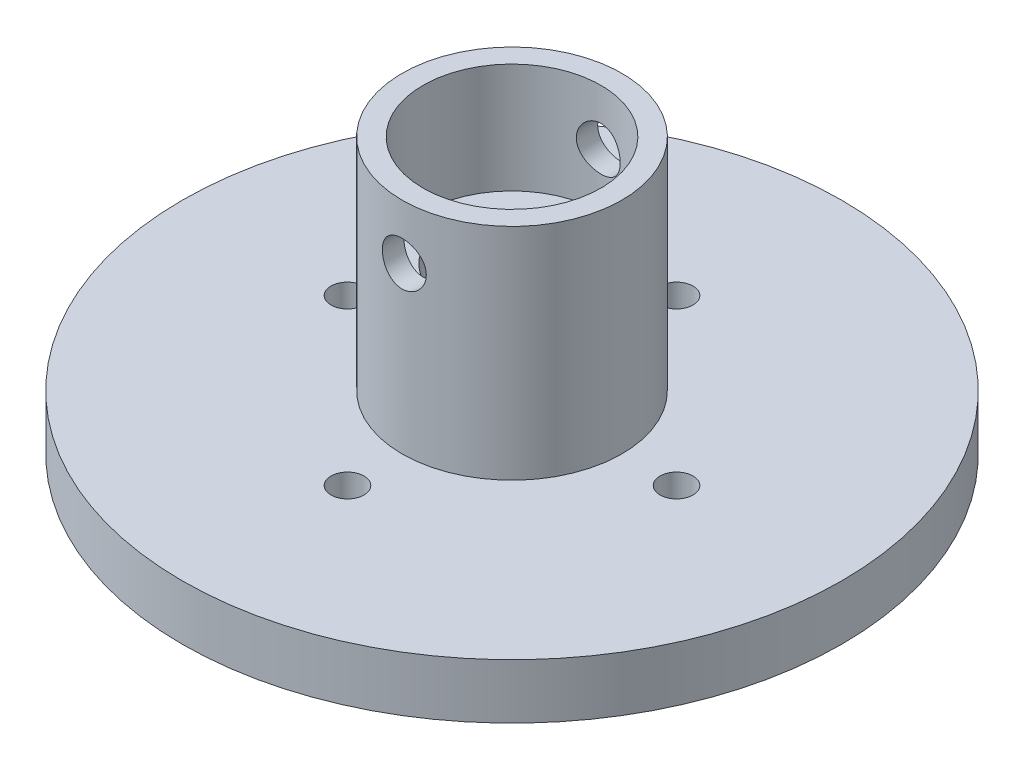
ISO-10303-21;
HEADER;
FILE_DESCRIPTION(('STEP AP214'),'2;1');
FILE_NAME('part.step','',(''),(''),'','','');
FILE_SCHEMA(('AUTOMOTIVE_DESIGN { 1 0 10303 214 1 1 1 1 }'));
ENDSEC;
DATA;
#1=APPLICATION_CONTEXT('core data for automotive mechanical design processes');
#2=APPLICATION_PROTOCOL_DEFINITION('international standard','automotive_design',2000,#1);
#3=PRODUCT_CONTEXT('',#1,'mechanical');
#4=PRODUCT('Part','Part','',(#3));
#5=PRODUCT_RELATED_PRODUCT_CATEGORY('part','',(#4));
#6=PRODUCT_DEFINITION_FORMATION('','',#4);
#7=PRODUCT_DEFINITION_CONTEXT('part definition',#1,'design');
#8=PRODUCT_DEFINITION('design','',#6,#7);
#9=PRODUCT_DEFINITION_SHAPE('','',#8);
#10=(LENGTH_UNIT() NAMED_UNIT(*) SI_UNIT(.MILLI.,.METRE.));
#11=(NAMED_UNIT(*) PLANE_ANGLE_UNIT() SI_UNIT($,.RADIAN.));
#12=(NAMED_UNIT(*) SI_UNIT($,.STERADIAN.) SOLID_ANGLE_UNIT());
#13=UNCERTAINTY_MEASURE_WITH_UNIT(LENGTH_MEASURE(1.E-05),#10,'distance_accuracy_value','');
#14=(GEOMETRIC_REPRESENTATION_CONTEXT(3) GLOBAL_UNCERTAINTY_ASSIGNED_CONTEXT((#13)) GLOBAL_UNIT_ASSIGNED_CONTEXT((#10,
#11,#12)) REPRESENTATION_CONTEXT('',''));
#15=CARTESIAN_POINT('',(0.,0.,0.));
#16=DIRECTION('',(0.,0.,1.));
#17=DIRECTION('',(1.,0.,0.));
#18=AXIS2_PLACEMENT_3D('',#15,#16,#17);
#19=CARTESIAN_POINT('',(0.,-105.,0.));
#20=DIRECTION('',(0.,1.,0.));
#21=DIRECTION('',(0.,0.,1.));
#22=AXIS2_PLACEMENT_3D('',#19,#20,#21);
#23=CYLINDRICAL_SURFACE('',#22,6.);
#24=CARTESIAN_POINT('',(0.,0.,0.));
#25=DIRECTION('',(0.,1.,0.));
#26=DIRECTION('',(0.,0.,1.));
#27=AXIS2_PLACEMENT_3D('',#24,#25,#26);
#28=CIRCLE('',#27,6.);
#29=CARTESIAN_POINT('',(0.,0.,6.));
#30=VERTEX_POINT('',#29);
#31=EDGE_CURVE('E59',#30,#30,#28,.T.);
#32=ORIENTED_EDGE('',*,*,#31,.F.);
#33=EDGE_LOOP('',(#32));
#34=FACE_BOUND('',#33,.T.);
#35=CARTESIAN_POINT('',(0.,15.,0.));
#36=DIRECTION('',(0.,1.,0.));
#37=DIRECTION('',(0.,0.,1.));
#38=AXIS2_PLACEMENT_3D('',#35,#36,#37);
#39=CIRCLE('',#38,6.);
#40=CARTESIAN_POINT('',(0.,15.,6.));
#41=VERTEX_POINT('',#40);
#42=EDGE_CURVE('E82',#41,#41,#39,.F.);
#43=ORIENTED_EDGE('',*,*,#42,.F.);
#44=EDGE_LOOP('',(#43));
#45=FACE_BOUND('',#44,.T.);
#46=ADVANCED_FACE('F36',(#34,#45),#23,.F.);
#47=CARTESIAN_POINT('',(0.,95.,0.));
#48=DIRECTION('',(0.,-1.,0.));
#49=DIRECTION('',(0.,0.,-1.));
#50=AXIS2_PLACEMENT_3D('',#47,#48,#49);
#51=CYLINDRICAL_SURFACE('',#50,10.);
#52=CARTESIAN_POINT('',(0.,18.,10.));
#53=CARTESIAN_POINT('',(-0.111153813585266,18.0000040889967,9.99999795161742));
#54=CARTESIAN_POINT('',(-0.222359320403045,18.0092976859353,9.99812770356462));
#55=CARTESIAN_POINT('',(-0.441627015378039,18.0461970002305,9.99084731246463));
#56=CARTESIAN_POINT('',(-0.549686635082712,18.073817265603,9.98543435720372));
#57=CARTESIAN_POINT('',(-0.759460610526626,18.1464825472416,9.97167298556573));
#58=CARTESIAN_POINT('',(-0.861180935866267,18.1915108736894,9.96332738153436));
#59=CARTESIAN_POINT('',(-1.05561597772845,18.2976644950226,9.94460796070629));
#60=CARTESIAN_POINT('',(-1.14833123015162,18.3587888312144,9.93423426471414));
#61=CARTESIAN_POINT('',(-1.32338695462973,18.4962769885829,9.9124433065994));
#62=CARTESIAN_POINT('',(-1.40558790231705,18.5728167107824,9.90101491008695));
#63=CARTESIAN_POINT('',(-1.55607351321606,18.7385848327834,9.87848360905177));
#64=CARTESIAN_POINT('',(-1.62435708954085,18.8278142226702,9.86738073000848));
#65=CARTESIAN_POINT('',(-1.74566350669524,19.0174323860237,9.8466488362523));
#66=CARTESIAN_POINT('',(-1.79854187773174,19.1179152875927,9.83703414729892));
#67=CARTESIAN_POINT('',(-1.88661133316062,19.3265636380081,9.82052536116836));
#68=CARTESIAN_POINT('',(-1.92180416487448,19.4347283266927,9.81363099523923));
#69=CARTESIAN_POINT('',(-1.97305059976966,19.6541687278158,9.80345610504409));
#70=CARTESIAN_POINT('',(-1.98934899591756,19.7653850882844,9.80012940214375));
#71=CARTESIAN_POINT('',(-2.00310425545224,19.9890196427287,9.79732750121254));
#72=CARTESIAN_POINT('',(-2.000563045427,20.1014377126403,9.79785190935681));
#73=CARTESIAN_POINT('',(-1.97690914620364,20.322493576042,9.80265102296369));
#74=CARTESIAN_POINT('',(-1.95607708048781,20.4311628112546,9.80686905717527));
#75=CARTESIAN_POINT('',(-1.8968757692461,20.643432153326,9.81849092320002));
#76=CARTESIAN_POINT('',(-1.85850568620136,20.747032017838,9.82589490715558));
#77=CARTESIAN_POINT('',(-1.76504956734944,20.9470305234072,9.84311237000816));
#78=CARTESIAN_POINT('',(-1.70985230246423,21.0433757591383,9.85294179627409));
#79=CARTESIAN_POINT('',(-1.58438714914536,21.2255416999456,9.87389237546124));
#80=CARTESIAN_POINT('',(-1.51411752871366,21.3113611937023,9.88501367676732));
#81=CARTESIAN_POINT('',(-1.35899986912117,21.4716588049139,9.90754042482924));
#82=CARTESIAN_POINT('',(-1.27391232242489,21.5459051357183,9.9189473842181));
#83=CARTESIAN_POINT('',(-1.09237004812402,21.6791076926024,9.94057697428817));
#84=CARTESIAN_POINT('',(-0.99591517475878,21.7380637225871,9.95079958977947));
#85=CARTESIAN_POINT('',(-0.794118773757843,21.8390550184519,9.96893380321774));
#86=CARTESIAN_POINT('',(-0.688763639170602,21.8810637872891,9.97684177696544));
#87=CARTESIAN_POINT('',(-0.472297952897332,21.9467209480771,9.98942817975717));
#88=CARTESIAN_POINT('',(-0.361188100144901,21.9703715641472,9.99410700001063));
#89=CARTESIAN_POINT('',(-0.138358811254303,21.9983129075885,9.99965343733735));
#90=CARTESIAN_POINT('',(-0.0266806566511544,22.0029208390805,10.0005834930494));
#91=CARTESIAN_POINT('',(0.195849868385427,21.9935002821156,9.99870103860205));
#92=CARTESIAN_POINT('',(0.306702284887585,21.9794728412948,9.99588873882892));
#93=CARTESIAN_POINT('',(0.52341131989308,21.9334432529121,9.98687664016035));
#94=CARTESIAN_POINT('',(0.629303896679804,21.9016038630042,9.98070752808413));
#95=CARTESIAN_POINT('',(0.834247254999332,21.8210320346884,9.96567104122065));
#96=CARTESIAN_POINT('',(0.933297523275078,21.7722983306463,9.95680346428454));
#97=CARTESIAN_POINT('',(1.12308234737243,21.6586350186974,9.93719823066589));
#98=CARTESIAN_POINT('',(1.21370025350438,21.5935144379221,9.92643900874104));
#99=CARTESIAN_POINT('',(1.38283603823841,21.4491816175854,9.90429469659765));
#100=CARTESIAN_POINT('',(1.46135261786152,21.3699678672003,9.89290953936776));
#101=CARTESIAN_POINT('',(1.60528118154835,21.1982532962177,9.8705860711393));
#102=CARTESIAN_POINT('',(1.67047540489731,21.1055685115573,9.85965720466609));
#103=CARTESIAN_POINT('',(1.78437084010241,20.9103772772866,9.83968383592389));
#104=CARTESIAN_POINT('',(1.8330727118458,20.8078712208529,9.83063925826685));
#105=CARTESIAN_POINT('',(1.91230368316392,20.5964635077009,9.81553481168766));
#106=CARTESIAN_POINT('',(1.9429269995821,20.4875983175794,9.80945949744373));
#107=CARTESIAN_POINT('',(1.98541730325439,20.2661330930182,9.8009487358405));
#108=CARTESIAN_POINT('',(1.99728673645022,20.1535335475813,9.79851281382223));
#109=CARTESIAN_POINT('',(2.00184182173494,19.9299822709114,9.79758299262758));
#110=CARTESIAN_POINT('',(1.99487157614179,19.819037702146,9.79901838378602));
#111=CARTESIAN_POINT('',(1.96270460820012,19.5999367001899,9.80551146969228));
#112=CARTESIAN_POINT('',(1.9375080322586,19.4917802446104,9.81056913534338));
#113=CARTESIAN_POINT('',(1.86975713699791,19.2815445775189,9.82370528438317));
#114=CARTESIAN_POINT('',(1.82724501343469,19.1794512789952,9.83177642037661));
#115=CARTESIAN_POINT('',(1.72610928920321,18.9837925585311,9.85003429948341));
#116=CARTESIAN_POINT('',(1.66748433754976,18.8902278525497,9.86022121997788));
#117=CARTESIAN_POINT('',(1.53461182957283,18.7125688556994,9.88177921046451));
#118=CARTESIAN_POINT('',(1.46011577447036,18.6286624694648,9.89316745819399));
#119=CARTESIAN_POINT('',(1.29812873802628,18.4744275889417,9.91572163743909));
#120=CARTESIAN_POINT('',(1.21063477430667,18.4041022193654,9.92688751726369));
#121=CARTESIAN_POINT('',(1.02403525817649,18.2783307121071,9.94787664775943));
#122=CARTESIAN_POINT('',(0.92481776885967,18.2230479934399,9.95768462438492));
#123=CARTESIAN_POINT('',(0.718332721881466,18.1300277548068,9.9747025017));
#124=CARTESIAN_POINT('',(0.611072521726254,18.092274420935,9.98191474277232));
#125=CARTESIAN_POINT('',(0.41964297784756,18.0426961039106,9.99152745190741));
#126=CARTESIAN_POINT('',(0.33656332802757,18.0267136125845,9.99468606316904));
#127=CARTESIAN_POINT('',(0.168999050420134,18.0053641752833,9.99892308279786));
#128=CARTESIAN_POINT('',(0.0845144674972382,17.9999968909805,10.0000015574631));
#129=CARTESIAN_POINT('',(0.,18.,10.));
#130=B_SPLINE_CURVE_WITH_KNOTS('',3,(#52,#53,#54,#55,#56,#57,#58,#59,#60,#61,#62,#63,#64,#65,
#66,#67,#68,#69,#70,#71,#72,#73,#74,#75,#76,#77,#78,#79,#80,#81,#82,#83,#84,#85,#86,#87,#88,#89,
#90,#91,#92,#93,#94,#95,#96,#97,#98,#99,#100,#101,#102,#103,#104,#105,#106,#107,#108,#109,#110,
#111,#112,#113,#114,#115,#116,#117,#118,#119,#120,#121,#122,#123,#124,#125,#126,#127,#128,#129),
.UNSPECIFIED.,.T.,.F.,(4,2,2,2,2,2,2,2,2,2,2,2,2,2,2,2,2,2,2,2,2,2,2,2,2,2,2,2,2,2,2,2,2,2,2,2,
2,2,4),(0.,0.333152261322517,0.666569301382647,0.999667470500682,1.33274580446173,
1.66986534022437,2.00701119349473,2.34722390011846,2.68740298730395,3.02312370207175,
3.35881008562451,3.68943454012557,4.0200747850746,4.35294980407185,4.68586309499341,
5.02476504982701,5.36367135079641,5.70310549708048,6.04249851396072,6.3762147135253,
6.70991215315735,7.04060907901447,7.37133078432045,7.70610132066717,8.0409077669186,
8.38081257158451,8.72070377446934,9.05880762065446,9.3968673666083,9.72879445135403,
10.0607188698522,10.3918392250622,10.7229873516373,11.0597615247829,11.3966130906586,
11.7369899335127,12.0770591103504,12.3303755057979,12.5836838274199),.UNSPECIFIED.);
#131=CARTESIAN_POINT('',(0.,18.,10.));
#132=VERTEX_POINT('',#131);
#133=EDGE_CURVE('E108',#132,#132,#130,.T.);
#134=ORIENTED_EDGE('',*,*,#133,.T.);
#135=EDGE_LOOP('',(#134));
#136=FACE_BOUND('',#135,.T.);
#137=CARTESIAN_POINT('',(0.,22.,-10.));
#138=CARTESIAN_POINT('',(-0.111153813585266,21.9999959110033,-9.99999795161742));
#139=CARTESIAN_POINT('',(-0.222359320403043,21.9907023140647,-9.99812770356462));
#140=CARTESIAN_POINT('',(-0.441627015378038,21.9538029997695,-9.99084731246463));
#141=CARTESIAN_POINT('',(-0.549686635082711,21.926182734397,-9.98543435720372));
#142=CARTESIAN_POINT('',(-0.759460610526627,21.8535174527584,-9.97167298556573));
#143=CARTESIAN_POINT('',(-0.861180935866269,21.8084891263106,-9.96332738153436));
#144=CARTESIAN_POINT('',(-1.05561597772845,21.7023355049774,-9.94460796070629));
#145=CARTESIAN_POINT('',(-1.14833123015162,21.6412111687856,-9.93423426471414));
#146=CARTESIAN_POINT('',(-1.32338695462973,21.5037230114171,-9.9124433065994));
#147=CARTESIAN_POINT('',(-1.40558790231705,21.4271832892176,-9.90101491008695));
#148=CARTESIAN_POINT('',(-1.55607351321606,21.2614151672166,-9.87848360905177));
#149=CARTESIAN_POINT('',(-1.62435708954085,21.1721857773298,-9.86738073000847));
#150=CARTESIAN_POINT('',(-1.74566350669524,20.9825676139762,-9.8466488362523));
#151=CARTESIAN_POINT('',(-1.79854187773173,20.8820847124073,-9.83703414729892));
#152=CARTESIAN_POINT('',(-1.88661133316062,20.6734363619918,-9.82052536116836));
#153=CARTESIAN_POINT('',(-1.92180416487448,20.5652716733073,-9.81363099523923));
#154=CARTESIAN_POINT('',(-1.97305059976966,20.3458312721842,-9.80345610504409));
#155=CARTESIAN_POINT('',(-1.98934899591756,20.2346149117155,-9.80012940214375));
#156=CARTESIAN_POINT('',(-2.00310425545224,20.0109803572713,-9.79732750121254));
#157=CARTESIAN_POINT('',(-2.000563045427,19.8985622873597,-9.79785190935681));
#158=CARTESIAN_POINT('',(-1.97690914620364,19.677506423958,-9.80265102296369));
#159=CARTESIAN_POINT('',(-1.95607708048781,19.5688371887454,-9.80686905717527));
#160=CARTESIAN_POINT('',(-1.8968757692461,19.356567846674,-9.81849092320002));
#161=CARTESIAN_POINT('',(-1.85850568620136,19.252967982162,-9.82589490715558));
#162=CARTESIAN_POINT('',(-1.76504956734944,19.0529694765928,-9.84311237000816));
#163=CARTESIAN_POINT('',(-1.70985230246423,18.9566242408616,-9.85294179627409));
#164=CARTESIAN_POINT('',(-1.58438714914536,18.7744583000544,-9.87389237546124));
#165=CARTESIAN_POINT('',(-1.51411752871366,18.6886388062977,-9.88501367676732));
#166=CARTESIAN_POINT('',(-1.35899986912117,18.5283411950861,-9.90754042482924));
#167=CARTESIAN_POINT('',(-1.27391232242489,18.4540948642817,-9.9189473842181));
#168=CARTESIAN_POINT('',(-1.09237004812402,18.3208923073975,-9.94057697428817));
#169=CARTESIAN_POINT('',(-0.99591517475878,18.2619362774128,-9.95079958977947));
#170=CARTESIAN_POINT('',(-0.794118773757843,18.160944981548,-9.96893380321774));
#171=CARTESIAN_POINT('',(-0.688763639170602,18.1189362127109,-9.97684177696544));
#172=CARTESIAN_POINT('',(-0.472297952897332,18.0532790519229,-9.98942817975717));
#173=CARTESIAN_POINT('',(-0.361188100144902,18.0296284358527,-9.99410700001063));
#174=CARTESIAN_POINT('',(-0.138358811254303,18.0016870924114,-9.99965343733735));
#175=CARTESIAN_POINT('',(-0.0266806566511548,17.9970791609195,-10.0005834930494));
#176=CARTESIAN_POINT('',(0.195849868385426,18.0064997178844,-9.99870103860205));
#177=CARTESIAN_POINT('',(0.306702284887585,18.0205271587052,-9.99588873882892));
#178=CARTESIAN_POINT('',(0.52341131989308,18.0665567470879,-9.98687664016035));
#179=CARTESIAN_POINT('',(0.629303896679805,18.0983961369958,-9.98070752808413));
#180=CARTESIAN_POINT('',(0.834247254999333,18.1789679653116,-9.96567104122065));
#181=CARTESIAN_POINT('',(0.933297523275078,18.2277016693536,-9.95680346428454));
#182=CARTESIAN_POINT('',(1.12308234737244,18.3413649813026,-9.93719823066589));
#183=CARTESIAN_POINT('',(1.21370025350438,18.4064855620779,-9.92643900874104));
#184=CARTESIAN_POINT('',(1.38283603823841,18.5508183824146,-9.90429469659765));
#185=CARTESIAN_POINT('',(1.46135261786152,18.6300321327997,-9.89290953936776));
#186=CARTESIAN_POINT('',(1.60528118154835,18.8017467037822,-9.8705860711393));
#187=CARTESIAN_POINT('',(1.67047540489731,18.8944314884427,-9.85965720466609));
#188=CARTESIAN_POINT('',(1.78437084010241,19.0896227227134,-9.83968383592389));
#189=CARTESIAN_POINT('',(1.83307271184581,19.1921287791471,-9.83063925826685));
#190=CARTESIAN_POINT('',(1.91230368316392,19.4035364922991,-9.81553481168766));
#191=CARTESIAN_POINT('',(1.9429269995821,19.5124016824206,-9.80945949744373));
#192=CARTESIAN_POINT('',(1.98541730325439,19.7338669069818,-9.8009487358405));
#193=CARTESIAN_POINT('',(1.99728673645022,19.8464664524187,-9.79851281382223));
#194=CARTESIAN_POINT('',(2.00184182173494,20.0700177290886,-9.79758299262758));
#195=CARTESIAN_POINT('',(1.99487157614179,20.180962297854,-9.79901838378602));
#196=CARTESIAN_POINT('',(1.96270460820012,20.40006329981,-9.80551146969228));
#197=CARTESIAN_POINT('',(1.9375080322586,20.5082197553896,-9.81056913534338));
#198=CARTESIAN_POINT('',(1.86975713699791,20.7184554224811,-9.82370528438317));
#199=CARTESIAN_POINT('',(1.82724501343469,20.8205487210048,-9.83177642037661));
#200=CARTESIAN_POINT('',(1.72610928920321,21.0162074414689,-9.85003429948341));
#201=CARTESIAN_POINT('',(1.66748433754976,21.1097721474503,-9.86022121997788));
#202=CARTESIAN_POINT('',(1.53461182957283,21.2874311443006,-9.88177921046451));
#203=CARTESIAN_POINT('',(1.46011577447036,21.3713375305352,-9.89316745819399));
#204=CARTESIAN_POINT('',(1.29812873802628,21.5255724110583,-9.91572163743909));
#205=CARTESIAN_POINT('',(1.21063477430667,21.5958977806345,-9.92688751726369));
#206=CARTESIAN_POINT('',(1.02403525817649,21.7216692878929,-9.94787664775943));
#207=CARTESIAN_POINT('',(0.92481776885967,21.77695200656,-9.95768462438492));
#208=CARTESIAN_POINT('',(0.718332721881466,21.8699722451932,-9.9747025017));
#209=CARTESIAN_POINT('',(0.611072521726253,21.907725579065,-9.98191474277232));
#210=CARTESIAN_POINT('',(0.41964297784756,21.9573038960894,-9.99152745190741));
#211=CARTESIAN_POINT('',(0.336563328027569,21.9732863874155,-9.99468606316904));
#212=CARTESIAN_POINT('',(0.168999050420133,21.9946358247167,-9.99892308279786));
#213=CARTESIAN_POINT('',(0.0845144674972378,22.0000031090195,-10.0000015574631));
#214=CARTESIAN_POINT('',(0.,22.,-10.));
#215=B_SPLINE_CURVE_WITH_KNOTS('',3,(#137,#138,#139,#140,#141,#142,#143,#144,#145,#146,#147,
#148,#149,#150,#151,#152,#153,#154,#155,#156,#157,#158,#159,#160,#161,#162,#163,#164,#165,#166,
#167,#168,#169,#170,#171,#172,#173,#174,#175,#176,#177,#178,#179,#180,#181,#182,#183,#184,#185,
#186,#187,#188,#189,#190,#191,#192,#193,#194,#195,#196,#197,#198,#199,#200,#201,#202,#203,#204,
#205,#206,#207,#208,#209,#210,#211,#212,#213,#214),.UNSPECIFIED.,.T.,.F.,(4,2,2,2,2,2,2,2,2,2,2,
2,2,2,2,2,2,2,2,2,2,2,2,2,2,2,2,2,2,2,2,2,2,2,2,2,2,2,4),(0.,0.333152261322517,
0.666569301382647,0.999667470500686,1.33274580446173,1.66986534022437,2.00701119349473,
2.34722390011845,2.68740298730395,3.02312370207175,3.35881008562451,3.68943454012557,
4.0200747850746,4.35294980407185,4.68586309499341,5.02476504982701,5.36367135079641,
5.70310549708048,6.04249851396072,6.3762147135253,6.70991215315735,7.04060907901447,
7.37133078432045,7.70610132066718,8.04090776691861,8.38081257158452,8.72070377446934,
9.05880762065446,9.3968673666083,9.72879445135403,10.0607188698522,10.3918392250622,
10.7229873516373,11.0597615247829,11.3966130906586,11.7369899335127,12.0770591103504,
12.3303755057979,12.5836838274199),.UNSPECIFIED.);
#216=CARTESIAN_POINT('',(0.,22.,-10.));
#217=VERTEX_POINT('',#216);
#218=EDGE_CURVE('E115',#217,#217,#215,.T.);
#219=ORIENTED_EDGE('',*,*,#218,.T.);
#220=EDGE_LOOP('',(#219));
#221=FACE_BOUND('',#220,.T.);
#222=CARTESIAN_POINT('',(0.,5.,0.));
#223=DIRECTION('',(0.,1.,0.));
#224=DIRECTION('',(0.,0.,1.));
#225=AXIS2_PLACEMENT_3D('',#222,#223,#224);
#226=CIRCLE('',#225,10.);
#227=CARTESIAN_POINT('',(0.,5.,10.));
#228=VERTEX_POINT('',#227);
#229=EDGE_CURVE('E10',#228,#228,#226,.T.);
#230=ORIENTED_EDGE('',*,*,#229,.T.);
#231=EDGE_LOOP('',(#230));
#232=FACE_BOUND('',#231,.T.);
#233=CARTESIAN_POINT('',(0.,25.,0.));
#234=DIRECTION('',(0.,1.,0.));
#235=DIRECTION('',(0.,0.,1.));
#236=AXIS2_PLACEMENT_3D('',#233,#234,#235);
#237=CIRCLE('',#236,10.);
#238=CARTESIAN_POINT('',(0.,25.,10.));
#239=VERTEX_POINT('',#238);
#240=EDGE_CURVE('E85',#239,#239,#237,.T.);
#241=ORIENTED_EDGE('',*,*,#240,.F.);
#242=EDGE_LOOP('',(#241));
#243=FACE_BOUND('',#242,.T.);
#244=ADVANCED_FACE('F120',(#136,#221,#232,#243),#51,.T.);
#245=CARTESIAN_POINT('',(0.,5.,0.));
#246=DIRECTION('',(0.,-1.,0.));
#247=DIRECTION('',(0.,0.,-1.));
#248=AXIS2_PLACEMENT_3D('',#245,#246,#247);
#249=CYLINDRICAL_SURFACE('',#248,30.);
#250=CARTESIAN_POINT('',(0.,5.,0.));
#251=DIRECTION('',(0.,1.,0.));
#252=DIRECTION('',(0.,0.,1.));
#253=AXIS2_PLACEMENT_3D('',#250,#251,#252);
#254=CIRCLE('',#253,30.);
#255=CARTESIAN_POINT('',(0.,5.,30.));
#256=VERTEX_POINT('',#255);
#257=EDGE_CURVE('E50',#256,#256,#254,.T.);
#258=ORIENTED_EDGE('',*,*,#257,.F.);
#259=EDGE_LOOP('',(#258));
#260=FACE_BOUND('',#259,.T.);
#261=CARTESIAN_POINT('',(0.,0.,0.));
#262=DIRECTION('',(0.,1.,0.));
#263=DIRECTION('',(0.,0.,1.));
#264=AXIS2_PLACEMENT_3D('',#261,#262,#263);
#265=CIRCLE('',#264,30.);
#266=CARTESIAN_POINT('',(0.,0.,30.));
#267=VERTEX_POINT('',#266);
#268=EDGE_CURVE('E56',#267,#267,#265,.T.);
#269=ORIENTED_EDGE('',*,*,#268,.T.);
#270=EDGE_LOOP('',(#269));
#271=FACE_BOUND('',#270,.T.);
#272=ADVANCED_FACE('F38',(#260,#271),#249,.T.);
#273=CARTESIAN_POINT('',(0.,5.,0.));
#274=DIRECTION('',(0.,1.,0.));
#275=DIRECTION('',(0.,0.,1.));
#276=AXIS2_PLACEMENT_3D('',#273,#274,#275);
#277=PLANE('',#276);
#278=CARTESIAN_POINT('',(0.,5.,-14.9698194740176));
#279=DIRECTION('',(0.,1.,0.));
#280=DIRECTION('',(0.,0.,1.));
#281=AXIS2_PLACEMENT_3D('',#278,#279,#280);
#282=CIRCLE('',#281,1.5);
#283=CARTESIAN_POINT('',(0.,5.,-13.4698194740176));
#284=VERTEX_POINT('',#283);
#285=EDGE_CURVE('E70',#284,#284,#282,.T.);
#286=ORIENTED_EDGE('',*,*,#285,.F.);
#287=EDGE_LOOP('',(#286));
#288=FACE_BOUND('',#287,.T.);
#289=CARTESIAN_POINT('',(14.9698194740176,5.,0.));
#290=DIRECTION('',(0.,1.,0.));
#291=DIRECTION('',(0.,0.,1.));
#292=AXIS2_PLACEMENT_3D('',#289,#290,#291);
#293=CIRCLE('',#292,1.5);
#294=CARTESIAN_POINT('',(14.9698194740176,5.,1.5));
#295=VERTEX_POINT('',#294);
#296=EDGE_CURVE('E179',#295,#295,#293,.T.);
#297=ORIENTED_EDGE('',*,*,#296,.F.);
#298=EDGE_LOOP('',(#297));
#299=FACE_BOUND('',#298,.T.);
#300=CARTESIAN_POINT('',(0.,5.,14.9698194740176));
#301=DIRECTION('',(0.,1.,0.));
#302=DIRECTION('',(0.,0.,1.));
#303=AXIS2_PLACEMENT_3D('',#300,#301,#302);
#304=CIRCLE('',#303,1.5);
#305=CARTESIAN_POINT('',(0.,5.,16.4698194740176));
#306=VERTEX_POINT('',#305);
#307=EDGE_CURVE('E183',#306,#306,#304,.T.);
#308=ORIENTED_EDGE('',*,*,#307,.F.);
#309=EDGE_LOOP('',(#308));
#310=FACE_BOUND('',#309,.T.);
#311=CARTESIAN_POINT('',(-14.9698194740176,5.,0.));
#312=DIRECTION('',(0.,1.,0.));
#313=DIRECTION('',(0.,0.,1.));
#314=AXIS2_PLACEMENT_3D('',#311,#312,#313);
#315=CIRCLE('',#314,1.5);
#316=CARTESIAN_POINT('',(-14.9698194740176,5.,1.5));
#317=VERTEX_POINT('',#316);
#318=EDGE_CURVE('E175',#317,#317,#315,.T.);
#319=ORIENTED_EDGE('',*,*,#318,.F.);
#320=EDGE_LOOP('',(#319));
#321=FACE_BOUND('',#320,.T.);
#322=ORIENTED_EDGE('',*,*,#229,.F.);
#323=EDGE_LOOP('',(#322));
#324=FACE_BOUND('',#323,.T.);
#325=ORIENTED_EDGE('',*,*,#257,.T.);
#326=EDGE_LOOP('',(#325));
#327=FACE_BOUND('',#326,.T.);
#328=ADVANCED_FACE('F127',(#288,#299,#310,#321,#324,#327),#277,.T.);
#329=CARTESIAN_POINT('',(0.,0.,0.));
#330=DIRECTION('',(0.,1.,0.));
#331=DIRECTION('',(0.,0.,1.));
#332=AXIS2_PLACEMENT_3D('',#329,#330,#331);
#333=PLANE('',#332);
#334=CARTESIAN_POINT('',(0.,0.,-14.9698194740176));
#335=DIRECTION('',(0.,1.,0.));
#336=DIRECTION('',(0.,0.,1.));
#337=AXIS2_PLACEMENT_3D('',#334,#335,#336);
#338=CIRCLE('',#337,1.5);
#339=CARTESIAN_POINT('',(0.,0.,-13.4698194740176));
#340=VERTEX_POINT('',#339);
#341=EDGE_CURVE('E78',#340,#340,#338,.T.);
#342=ORIENTED_EDGE('',*,*,#341,.T.);
#343=EDGE_LOOP('',(#342));
#344=FACE_BOUND('',#343,.T.);
#345=CARTESIAN_POINT('',(14.9698194740176,0.,0.));
#346=DIRECTION('',(0.,1.,0.));
#347=DIRECTION('',(0.,0.,1.));
#348=AXIS2_PLACEMENT_3D('',#345,#346,#347);
#349=CIRCLE('',#348,1.5);
#350=CARTESIAN_POINT('',(14.9698194740176,0.,1.5));
#351=VERTEX_POINT('',#350);
#352=EDGE_CURVE('E74',#351,#351,#349,.T.);
#353=ORIENTED_EDGE('',*,*,#352,.T.);
#354=EDGE_LOOP('',(#353));
#355=FACE_BOUND('',#354,.T.);
#356=CARTESIAN_POINT('',(0.,0.,14.9698194740176));
#357=DIRECTION('',(0.,1.,0.));
#358=DIRECTION('',(0.,0.,1.));
#359=AXIS2_PLACEMENT_3D('',#356,#357,#358);
#360=CIRCLE('',#359,1.5);
#361=CARTESIAN_POINT('',(0.,0.,16.4698194740176));
#362=VERTEX_POINT('',#361);
#363=EDGE_CURVE('E69',#362,#362,#360,.T.);
#364=ORIENTED_EDGE('',*,*,#363,.T.);
#365=EDGE_LOOP('',(#364));
#366=FACE_BOUND('',#365,.T.);
#367=CARTESIAN_POINT('',(-14.9698194740176,0.,0.));
#368=DIRECTION('',(0.,1.,0.));
#369=DIRECTION('',(0.,0.,1.));
#370=AXIS2_PLACEMENT_3D('',#367,#368,#369);
#371=CIRCLE('',#370,1.5);
#372=CARTESIAN_POINT('',(-14.9698194740176,0.,1.5));
#373=VERTEX_POINT('',#372);
#374=EDGE_CURVE('E65',#373,#373,#371,.T.);
#375=ORIENTED_EDGE('',*,*,#374,.T.);
#376=EDGE_LOOP('',(#375));
#377=FACE_BOUND('',#376,.T.);
#378=ORIENTED_EDGE('',*,*,#31,.T.);
#379=EDGE_LOOP('',(#378));
#380=FACE_BOUND('',#379,.T.);
#381=ORIENTED_EDGE('',*,*,#268,.F.);
#382=EDGE_LOOP('',(#381));
#383=FACE_BOUND('',#382,.T.);
#384=ADVANCED_FACE('F130',(#344,#355,#366,#377,#380,#383),#333,.F.);
#385=CARTESIAN_POINT('',(-14.9698194740176,-5.,0.));
#386=DIRECTION('',(0.,1.,0.));
#387=DIRECTION('',(0.,0.,1.));
#388=AXIS2_PLACEMENT_3D('',#385,#386,#387);
#389=CYLINDRICAL_SURFACE('',#388,1.5);
#390=ORIENTED_EDGE('',*,*,#318,.T.);
#391=EDGE_LOOP('',(#390));
#392=FACE_BOUND('',#391,.T.);
#393=ORIENTED_EDGE('',*,*,#374,.F.);
#394=EDGE_LOOP('',(#393));
#395=FACE_BOUND('',#394,.T.);
#396=ADVANCED_FACE('F133',(#392,#395),#389,.F.);
#397=CARTESIAN_POINT('',(0.,-5.,14.9698194740176));
#398=DIRECTION('',(0.,1.,0.));
#399=DIRECTION('',(0.,0.,1.));
#400=AXIS2_PLACEMENT_3D('',#397,#398,#399);
#401=CYLINDRICAL_SURFACE('',#400,1.5);
#402=ORIENTED_EDGE('',*,*,#307,.T.);
#403=EDGE_LOOP('',(#402));
#404=FACE_BOUND('',#403,.T.);
#405=ORIENTED_EDGE('',*,*,#363,.F.);
#406=EDGE_LOOP('',(#405));
#407=FACE_BOUND('',#406,.T.);
#408=ADVANCED_FACE('F139',(#404,#407),#401,.F.);
#409=CARTESIAN_POINT('',(14.9698194740176,-5.,0.));
#410=DIRECTION('',(0.,1.,0.));
#411=DIRECTION('',(0.,0.,1.));
#412=AXIS2_PLACEMENT_3D('',#409,#410,#411);
#413=CYLINDRICAL_SURFACE('',#412,1.5);
#414=ORIENTED_EDGE('',*,*,#296,.T.);
#415=EDGE_LOOP('',(#414));
#416=FACE_BOUND('',#415,.T.);
#417=ORIENTED_EDGE('',*,*,#352,.F.);
#418=EDGE_LOOP('',(#417));
#419=FACE_BOUND('',#418,.T.);
#420=ADVANCED_FACE('F220',(#416,#419),#413,.F.);
#421=CARTESIAN_POINT('',(0.,-5.,-14.9698194740176));
#422=DIRECTION('',(0.,1.,0.));
#423=DIRECTION('',(0.,0.,1.));
#424=AXIS2_PLACEMENT_3D('',#421,#422,#423);
#425=CYLINDRICAL_SURFACE('',#424,1.5);
#426=ORIENTED_EDGE('',*,*,#285,.T.);
#427=EDGE_LOOP('',(#426));
#428=FACE_BOUND('',#427,.T.);
#429=ORIENTED_EDGE('',*,*,#341,.F.);
#430=EDGE_LOOP('',(#429));
#431=FACE_BOUND('',#430,.T.);
#432=ADVANCED_FACE('F161',(#428,#431),#425,.F.);
#433=CARTESIAN_POINT('',(0.,25.,0.));
#434=DIRECTION('',(0.,1.,0.));
#435=DIRECTION('',(0.,0.,1.));
#436=AXIS2_PLACEMENT_3D('',#433,#434,#435);
#437=PLANE('',#436);
#438=CARTESIAN_POINT('',(0.,25.,0.));
#439=DIRECTION('',(0.,1.,0.));
#440=DIRECTION('',(0.,0.,1.));
#441=AXIS2_PLACEMENT_3D('',#438,#439,#440);
#442=CIRCLE('',#441,8.1);
#443=CARTESIAN_POINT('',(0.,25.,8.1));
#444=VERTEX_POINT('',#443);
#445=EDGE_CURVE('E167',#444,#444,#442,.T.);
#446=ORIENTED_EDGE('',*,*,#445,.F.);
#447=EDGE_LOOP('',(#446));
#448=FACE_BOUND('',#447,.T.);
#449=ORIENTED_EDGE('',*,*,#240,.T.);
#450=EDGE_LOOP('',(#449));
#451=FACE_BOUND('',#450,.T.);
#452=ADVANCED_FACE('F154',(#448,#451),#437,.T.);
#453=CARTESIAN_POINT('',(0.,15.,0.));
#454=DIRECTION('',(0.,1.,0.));
#455=DIRECTION('',(0.,0.,1.));
#456=AXIS2_PLACEMENT_3D('',#453,#454,#455);
#457=PLANE('',#456);
#458=CARTESIAN_POINT('',(0.,15.,0.));
#459=DIRECTION('',(0.,1.,0.));
#460=DIRECTION('',(0.,0.,1.));
#461=AXIS2_PLACEMENT_3D('',#458,#459,#460);
#462=CIRCLE('',#461,8.1);
#463=CARTESIAN_POINT('',(0.,15.,8.1));
#464=VERTEX_POINT('',#463);
#465=EDGE_CURVE('E86',#464,#464,#462,.T.);
#466=ORIENTED_EDGE('',*,*,#465,.T.);
#467=EDGE_LOOP('',(#466));
#468=FACE_BOUND('',#467,.T.);
#469=ORIENTED_EDGE('',*,*,#42,.T.);
#470=EDGE_LOOP('',(#469));
#471=FACE_BOUND('',#470,.T.);
#472=ADVANCED_FACE('F102',(#468,#471),#457,.T.);
#473=CARTESIAN_POINT('',(0.,15.,0.));
#474=DIRECTION('',(0.,1.,0.));
#475=DIRECTION('',(0.,0.,1.));
#476=AXIS2_PLACEMENT_3D('',#473,#474,#475);
#477=CYLINDRICAL_SURFACE('',#476,8.1);
#478=CARTESIAN_POINT('',(0.,18.,8.1));
#479=CARTESIAN_POINT('',(0.110545583469339,18.0000031808018,8.0999981026841));
#480=CARTESIAN_POINT('',(0.221126977788258,18.0091960909829,8.09771438246924));
#481=CARTESIAN_POINT('',(0.439123427860197,18.0456715390887,8.08882537837536));
#482=CARTESIAN_POINT('',(0.546536602374567,18.0729646074016,8.08221757884447));
#483=CARTESIAN_POINT('',(0.755016820808285,18.1447135257649,8.06541254718385));
#484=CARTESIAN_POINT('',(0.856091219546835,18.1891490406364,8.05521956922177));
#485=CARTESIAN_POINT('',(1.04935069271433,18.2938506580749,8.03233124251775));
#486=CARTESIAN_POINT('',(1.14153552079006,18.3541171991888,8.01963582445632));
#487=CARTESIAN_POINT('',(1.3162548042095,18.4900515914818,7.99283648874384));
#488=CARTESIAN_POINT('',(1.39858484293505,18.5659779983128,7.97871126972297));
#489=CARTESIAN_POINT('',(1.54948127297936,18.7305231249334,7.95078671930729));
#490=CARTESIAN_POINT('',(1.61804614696633,18.8191432421057,7.93698742398677));
#491=CARTESIAN_POINT('',(1.74042109712307,19.0081395003821,7.91106289647882));
#492=CARTESIAN_POINT('',(1.79400365913528,19.1086670068821,7.89896473469306));
#493=CARTESIAN_POINT('',(1.88343025966376,19.3176494879357,7.87812244225795));
#494=CARTESIAN_POINT('',(1.9192770577803,19.4261032261894,7.8693777898662));
#495=CARTESIAN_POINT('',(1.97151947246506,19.6456148390299,7.85645135709272));
#496=CARTESIAN_POINT('',(1.98828206698088,19.7565801966472,7.85218361935947));
#497=CARTESIAN_POINT('',(2.00302312624104,19.9798237945655,7.84843684341773));
#498=CARTESIAN_POINT('',(2.00100456736566,20.0921018240216,7.84895704643075));
#499=CARTESIAN_POINT('',(1.97853367663784,20.3119800127045,7.8546500499978));
#500=CARTESIAN_POINT('',(1.95851746934145,20.4196280365297,7.85971276879229));
#501=CARTESIAN_POINT('',(1.90131468565829,20.6299889105459,7.87374507615152));
#502=CARTESIAN_POINT('',(1.86412691283428,20.7327014163016,7.88271493694582));
#503=CARTESIAN_POINT('',(1.77326200260524,20.9314509410043,7.9036526585465));
#504=CARTESIAN_POINT('',(1.71942561248846,21.0274119976848,7.91564925824948));
#505=CARTESIAN_POINT('',(1.59690312031997,21.2090950417442,7.94127237668642));
#506=CARTESIAN_POINT('',(1.52821447859418,21.2948152740874,7.95489917399926));
#507=CARTESIAN_POINT('',(1.37567304865247,21.4560839162492,7.98271171978005));
#508=CARTESIAN_POINT('',(1.29145192048616,21.5312834830435,7.99690247817071));
#509=CARTESIAN_POINT('',(1.11142498318419,21.6665568171925,8.02390220160085));
#510=CARTESIAN_POINT('',(1.01561883718638,21.7266301445591,8.03671112643969));
#511=CARTESIAN_POINT('',(0.814651246139697,21.8300693842615,8.05956519588874));
#512=CARTESIAN_POINT('',(0.709460110779658,21.8733797801153,8.06960112586155));
#513=CARTESIAN_POINT('',(0.492987534526688,21.9416064141466,8.08571130282996));
#514=CARTESIAN_POINT('',(0.38170723338147,21.9665260820685,8.09178628848983));
#515=CARTESIAN_POINT('',(0.15919871264399,21.9967337831992,8.09918121328358));
#516=CARTESIAN_POINT('',(0.0480387364401073,22.0024970166022,8.10061622786963));
#517=CARTESIAN_POINT('',(-0.173657140371337,21.9955299989344,8.09889672829852));
#518=CARTESIAN_POINT('',(-0.284193094835745,21.9828013690978,8.09574261648306));
#519=CARTESIAN_POINT('',(-0.499859922298573,21.9396039269268,8.08527289567249));
#520=CARTESIAN_POINT('',(-0.605045720616047,21.9093933176459,8.07801789093633));
#521=CARTESIAN_POINT('',(-0.808851712325473,21.8323835396491,8.06016335891014));
#522=CARTESIAN_POINT('',(-0.907471251049991,21.7855827197937,8.0495634987351));
#523=CARTESIAN_POINT('',(-1.09724373929165,21.6757929328496,8.0259184803587));
#524=CARTESIAN_POINT('',(-1.18823690177451,21.6125364476148,8.01283398121718));
#525=CARTESIAN_POINT('',(-1.35848563470847,21.4719739387323,7.98573484004483));
#526=CARTESIAN_POINT('',(-1.43773922780977,21.3946655531309,7.97172004189384));
#527=CARTESIAN_POINT('',(-1.58420926499719,21.2259897340078,7.94392732025302));
#528=CARTESIAN_POINT('',(-1.65109276418645,21.1343304573452,7.9301630626921));
#529=CARTESIAN_POINT('',(-1.76852736732219,20.9408076480333,7.90480451424372));
#530=CARTESIAN_POINT('',(-1.81907919962203,20.8389445707145,7.89321012659495));
#531=CARTESIAN_POINT('',(-1.90204123195788,20.6284555902288,7.87363047804485));
#532=CARTESIAN_POINT('',(-1.93455891232063,20.5198741362753,7.86562389065281));
#533=CARTESIAN_POINT('',(-1.98081696754163,20.2985583422714,7.85410358054682));
#534=CARTESIAN_POINT('',(-1.9945613291166,20.1858248891666,7.85058890393736));
#535=CARTESIAN_POINT('',(-2.00267816317894,19.9627897669698,7.84852179135449));
#536=CARTESIAN_POINT('',(-1.99758229189818,19.8525083948996,7.84983316330369));
#537=CARTESIAN_POINT('',(-1.9693771543632,19.6344294726544,7.85695622197559));
#538=CARTESIAN_POINT('',(-1.94626823307147,19.5266318749539,7.86276782251574));
#539=CARTESIAN_POINT('',(-1.8829800237219,19.3171423104088,7.87816156393965));
#540=CARTESIAN_POINT('',(-1.842898135927,19.2154192273068,7.88772216816157));
#541=CARTESIAN_POINT('',(-1.74687925736845,19.0200699997942,7.90954019831887));
#542=CARTESIAN_POINT('',(-1.69094012142792,18.9264449531283,7.92179798908083));
#543=CARTESIAN_POINT('',(-1.56311786108893,18.7473748538981,7.94801955054695));
#544=CARTESIAN_POINT('',(-1.49086476919789,18.6621990435172,7.96201883413682));
#545=CARTESIAN_POINT('',(-1.33318963675981,18.5050078625311,7.98993141360656));
#546=CARTESIAN_POINT('',(-1.24776448487387,18.4329956100623,8.00384468836081));
#547=CARTESIAN_POINT('',(-1.06436113127989,18.3029457285448,8.03030877753284));
#548=CARTESIAN_POINT('',(-0.966188970653451,18.2451754720105,8.04283140241089));
#549=CARTESIAN_POINT('',(-0.76122717483356,18.1470504934888,8.06480757789519));
#550=CARTESIAN_POINT('',(-0.654443894975599,18.1066830646877,8.07426336652268));
#551=CARTESIAN_POINT('',(-0.456514567109944,18.0506292652181,8.08761183192724));
#552=CARTESIAN_POINT('',(-0.366326112350305,18.0316838055024,8.09222582158121));
#553=CARTESIAN_POINT('',(-0.18409996225715,18.0063682977446,8.09842058727924));
#554=CARTESIAN_POINT('',(-0.0920623995506594,17.9999973510271,8.10000158008532));
#555=CARTESIAN_POINT('',(0.,18.,8.1));
#556=B_SPLINE_CURVE_WITH_KNOTS('',3,(#478,#479,#480,#481,#482,#483,#484,#485,#486,#487,#488,
#489,#490,#491,#492,#493,#494,#495,#496,#497,#498,#499,#500,#501,#502,#503,#504,#505,#506,#507,
#508,#509,#510,#511,#512,#513,#514,#515,#516,#517,#518,#519,#520,#521,#522,#523,#524,#525,#526,
#527,#528,#529,#530,#531,#532,#533,#534,#535,#536,#537,#538,#539,#540,#541,#542,#543,#544,#545,
#546,#547,#548,#549,#550,#551,#552,#553,#554,#555),.UNSPECIFIED.,.T.,.F.,(4,2,2,2,2,2,2,2,2,2,2,
2,2,2,2,2,2,2,2,2,2,2,2,2,2,2,2,2,2,2,2,2,2,2,2,2,2,2,4),(0.,0.331299417380291,
0.662791748853552,0.993892051669015,1.32500152750312,1.66209246154465,1.99922053268623,
2.34121991937669,2.68316607584569,3.01841945352091,3.35361970216199,3.68090988963118,
4.00822288464666,4.33876906415253,4.669371810461,5.00916129222662,5.34896065656256,
5.68987595103809,6.0307276510764,6.36305835303438,6.69535992037495,7.02287441785174,
7.35042152034405,7.68366825289254,8.01697105205404,8.35823950569427,8.69949273747454,
9.03868968388493,9.3778145869605,9.70744364788822,10.0370663963445,10.3648226873897,
10.6926233386556,11.0287771530255,11.3650104914159,11.7071434599883,12.0490261925938,
12.3249521807821,12.6008584483737),.UNSPECIFIED.);
#557=CARTESIAN_POINT('',(0.,18.,8.1));
#558=VERTEX_POINT('',#557);
#559=EDGE_CURVE('E40',#558,#558,#556,.T.);
#560=ORIENTED_EDGE('',*,*,#559,.T.);
#561=EDGE_LOOP('',(#560));
#562=FACE_BOUND('',#561,.T.);
#563=CARTESIAN_POINT('',(-2.,20.,-7.84920378127616));
#564=CARTESIAN_POINT('',(-1.99999678397343,20.1104876615767,-7.84920591539791));
#565=CARTESIAN_POINT('',(-1.9908131747746,20.2210112101557,-7.85156213471632));
#566=CARTESIAN_POINT('',(-1.95437801333323,20.4388876491119,-7.8607090720356));
#567=CARTESIAN_POINT('',(-1.92711568340586,20.5462386082396,-7.86750243521704));
#568=CARTESIAN_POINT('',(-1.8554565937582,20.7545868941729,-7.88470842533866));
#569=CARTESIAN_POINT('',(-1.81108160407167,20.8555921046923,-7.89511645218404));
#570=CARTESIAN_POINT('',(-1.70652276362696,21.0487344200099,-7.91837334334561));
#571=CARTESIAN_POINT('',(-1.6463383431936,21.1408712050807,-7.93122229561319));
#572=CARTESIAN_POINT('',(-1.51048907962615,21.3156395491142,-7.95822205904228));
#573=CARTESIAN_POINT('',(-1.43454719463505,21.3980526539703,-7.97239325207674));
#574=CARTESIAN_POINT('',(-1.26993558847449,21.5491108766351,-8.00026378664802));
#575=CARTESIAN_POINT('',(-1.18126470082684,21.6177547312543,-8.01396308479785));
#576=CARTESIAN_POINT('',(-0.992218842682537,21.7402166060925,-8.03957143412214));
#577=CARTESIAN_POINT('',(-0.891701200876074,21.7938204847682,-8.05145362823682));
#578=CARTESIAN_POINT('',(-0.682739874080394,21.8832891550057,-8.07185668041599));
#579=CARTESIAN_POINT('',(-0.574297331543042,21.919156497695,-8.08037802185169));
#580=CARTESIAN_POINT('',(-0.354841320347156,21.9714355457402,-8.0929551642438));
#581=CARTESIAN_POINT('',(-0.243921151533566,21.9882181003906,-8.09709597103497));
#582=CARTESIAN_POINT('',(-0.0207676163719853,22.0030147739514,-8.10074153458209));
#583=CARTESIAN_POINT('',(0.0914655580641454,22.0010316023016,-8.10024696060532));
#584=CARTESIAN_POINT('',(0.311488791515521,21.9786208304571,-8.09474094201786));
#585=CARTESIAN_POINT('',(0.419322438153976,21.9585934644141,-8.08982751524142));
#586=CARTESIAN_POINT('',(0.630048591533577,21.9013055552876,-8.07614973465562));
#587=CARTESIAN_POINT('',(0.732940838601335,21.8640441076346,-8.06738517871231));
#588=CARTESIAN_POINT('',(0.931923776949075,21.7730188251175,-8.04683918270633));
#589=CARTESIAN_POINT('',(1.02794607184029,21.7191115983136,-8.03503168195422));
#590=CARTESIAN_POINT('',(1.20972243515026,21.5964335535906,-8.00968207863599));
#591=CARTESIAN_POINT('',(1.29547475259133,21.5276602066661,-7.99613968109131));
#592=CARTESIAN_POINT('',(1.4566633672542,21.3750530139476,-7.96837537132784));
#593=CARTESIAN_POINT('',(1.53176734969034,21.2908693447313,-7.95414495892642));
#594=CARTESIAN_POINT('',(1.66686493165234,21.1109531984153,-7.92693660165552));
#595=CARTESIAN_POINT('',(1.72685786003594,21.0152202086433,-7.91395871243138));
#596=CARTESIAN_POINT('',(1.83023613689313,20.8142831497553,-7.89069511112104));
#597=CARTESIAN_POINT('',(1.87354329907363,20.7090372781914,-7.88042214318997));
#598=CARTESIAN_POINT('',(1.94174725942949,20.4924442891946,-7.863896133129));
#599=CARTESIAN_POINT('',(1.96664788791499,20.3810984463192,-7.85764225468154));
#600=CARTESIAN_POINT('',(1.99678437046094,20.1585433498566,-7.85003754812759));
#601=CARTESIAN_POINT('',(2.00251079097721,20.0474046244837,-7.84856443645447));
#602=CARTESIAN_POINT('',(1.99547778924346,19.8257596045088,-7.8503555062944));
#603=CARTESIAN_POINT('',(1.98272002235406,19.7152532541638,-7.85361926359484));
#604=CARTESIAN_POINT('',(1.93951048198196,19.499819470325,-7.86439932429203));
#605=CARTESIAN_POINT('',(1.90934269772268,19.3948313343887,-7.87184732447175));
#606=CARTESIAN_POINT('',(1.83248356727791,19.1914019934243,-7.89009215692798));
#607=CARTESIAN_POINT('',(1.78579030094441,19.092961550773,-7.90088937834308));
#608=CARTESIAN_POINT('',(1.67617329419739,18.9033387661683,-7.92487470284589));
#609=CARTESIAN_POINT('',(1.6129553284401,18.8123319260728,-7.93810470500965));
#610=CARTESIAN_POINT('',(1.47245680756634,18.642038102358,-7.96536133074088));
#611=CARTESIAN_POINT('',(1.39517400069203,18.5627529990582,-7.9793880816188));
#612=CARTESIAN_POINT('',(1.22649142168295,18.4161747605708,-8.00707099927727));
#613=CARTESIAN_POINT('',(1.13479382568396,18.3492204842907,-8.02070983588926));
#614=CARTESIAN_POINT('',(0.941171578648882,18.2316615533839,-8.04572622330934));
#615=CARTESIAN_POINT('',(0.839247457739458,18.1810560518363,-8.05710389124176));
#616=CARTESIAN_POINT('',(0.628765273797226,18.0980651091759,-8.07624478060155));
#617=CARTESIAN_POINT('',(0.520260844565371,18.0655498439735,-8.08403368538539));
#618=CARTESIAN_POINT('',(0.299110718408967,18.0192706909415,-8.09523175678378));
#619=CARTESIAN_POINT('',(0.186465803895055,18.0055032789245,-8.09864174653194));
#620=CARTESIAN_POINT('',(-0.0365809791932841,17.9973047950286,-8.10066512546705));
#621=CARTESIAN_POINT('',(-0.146963601111599,18.0023730699193,-8.09940271102295));
#622=CARTESIAN_POINT('',(-0.36525255098733,18.0305581616362,-8.09249756701357));
#623=CARTESIAN_POINT('',(-0.473158949221508,18.0536744655946,-8.08685496191948));
#624=CARTESIAN_POINT('',(-0.682922464893362,18.1170336874152,-8.07184164221426));
#625=CARTESIAN_POINT('',(-0.784807792209572,18.1571880782638,-8.06249021419462));
#626=CARTESIAN_POINT('',(-0.980452286748721,18.2534029377112,-8.04104532491071));
#627=CARTESIAN_POINT('',(-1.07421045004919,18.3094653677342,-8.02895152555543));
#628=CARTESIAN_POINT('',(-1.25332044445608,18.4374428035815,-8.002973024435));
#629=CARTESIAN_POINT('',(-1.33842348637016,18.5096988296533,-7.98905296658992));
#630=CARTESIAN_POINT('',(-1.49546657398212,18.6673475527618,-7.96115289832839));
#631=CARTESIAN_POINT('',(-1.56740329779211,18.7527435550641,-7.94717287369024));
#632=CARTESIAN_POINT('',(-1.69734637339636,18.9361065942657,-7.92044860578289));
#633=CARTESIAN_POINT('',(-1.75507736821843,19.0342729896127,-7.90773127328887));
#634=CARTESIAN_POINT('',(-1.85313041825463,19.2392170643236,-7.88533165132039));
#635=CARTESIAN_POINT('',(-1.89346536188947,19.3459882986665,-7.87564711636306));
#636=CARTESIAN_POINT('',(-1.9494494641392,19.543837960971,-7.86195269732293));
#637=CARTESIAN_POINT('',(-1.96836513579001,19.6339550655595,-7.85720736959049));
#638=CARTESIAN_POINT('',(-1.99364123539046,19.8160399208684,-7.85083214897551));
#639=CARTESIAN_POINT('',(-2.00000267767687,19.9080075214687,-7.84920200439767));
#640=CARTESIAN_POINT('',(-2.,20.,-7.84920378127616));
#641=B_SPLINE_CURVE_WITH_KNOTS('',3,(#563,#564,#565,#566,#567,#568,#569,#570,#571,#572,#573,
#574,#575,#576,#577,#578,#579,#580,#581,#582,#583,#584,#585,#586,#587,#588,#589,#590,#591,#592,
#593,#594,#595,#596,#597,#598,#599,#600,#601,#602,#603,#604,#605,#606,#607,#608,#609,#610,#611,
#612,#613,#614,#615,#616,#617,#618,#619,#620,#621,#622,#623,#624,#625,#626,#627,#628,#629,#630,
#631,#632,#633,#634,#635,#636,#637,#638,#639,#640),.UNSPECIFIED.,.T.,.F.,(4,2,2,2,2,2,2,2,2,2,2,
2,2,2,2,2,2,2,2,2,2,2,2,2,2,2,2,2,2,2,2,2,2,2,2,2,2,2,4),(0.,0.331125234667368,0.66244804833426,
0.993350749608865,1.32426537622907,1.66158395773232,1.998933470665,2.34086717443338,
2.68275168198782,3.01787276948169,3.35294547214233,3.6807641633169,4.00860006274377,
4.33934277764935,4.67014180243029,5.00967851003784,5.34923029516861,5.69035434623576,
6.03140739104809,6.36366516154123,6.69589317836302,7.02284924672977,7.34984331763481,
7.68311144510984,8.01643297527395,8.35786761637186,8.69928456718031,9.03821865719108,
9.37708902618854,9.70701742043643,10.0369364395029,10.3651618504182,10.6934277483575,
11.0293941184792,11.3654451370771,11.7075715659555,12.0494440822758,12.3251625837667,
12.6008588072779),.UNSPECIFIED.);
#642=CARTESIAN_POINT('',(-2.,20.,-7.84920378127616));
#643=VERTEX_POINT('',#642);
#644=EDGE_CURVE('E87',#643,#643,#641,.T.);
#645=ORIENTED_EDGE('',*,*,#644,.T.);
#646=EDGE_LOOP('',(#645));
#647=FACE_BOUND('',#646,.T.);
#648=ORIENTED_EDGE('',*,*,#465,.F.);
#649=EDGE_LOOP('',(#648));
#650=FACE_BOUND('',#649,.T.);
#651=ORIENTED_EDGE('',*,*,#445,.T.);
#652=EDGE_LOOP('',(#651));
#653=FACE_BOUND('',#652,.T.);
#654=ADVANCED_FACE('F93',(#562,#647,#650,#653),#477,.F.);
#655=CARTESIAN_POINT('',(0.,20.,10.));
#656=DIRECTION('',(0.,0.,-1.));
#657=DIRECTION('',(-1.,0.,0.));
#658=AXIS2_PLACEMENT_3D('',#655,#656,#657);
#659=CYLINDRICAL_SURFACE('',#658,2.);
#660=ORIENTED_EDGE('',*,*,#644,.F.);
#661=EDGE_LOOP('',(#660));
#662=FACE_BOUND('',#661,.T.);
#663=ORIENTED_EDGE('',*,*,#218,.F.);
#664=EDGE_LOOP('',(#663));
#665=FACE_BOUND('',#664,.T.);
#666=ADVANCED_FACE('F97',(#662,#665),#659,.F.);
#667=ORIENTED_EDGE('',*,*,#559,.F.);
#668=EDGE_LOOP('',(#667));
#669=FACE_BOUND('',#668,.T.);
#670=ORIENTED_EDGE('',*,*,#133,.F.);
#671=EDGE_LOOP('',(#670));
#672=FACE_BOUND('',#671,.T.);
#673=ADVANCED_FACE('F100',(#669,#672),#659,.F.);
#674=CLOSED_SHELL('',(#46,#244,#272,#328,#384,#396,#408,#420,#432,#452,#472,#654,#666,#673));
#675=MANIFOLD_SOLID_BREP('B2',#674);
#676=ADVANCED_BREP_SHAPE_REPRESENTATION('',(#18,#675),#14);
#677=SHAPE_DEFINITION_REPRESENTATION(#9,#676);
ENDSEC;
END-ISO-10303-21;
